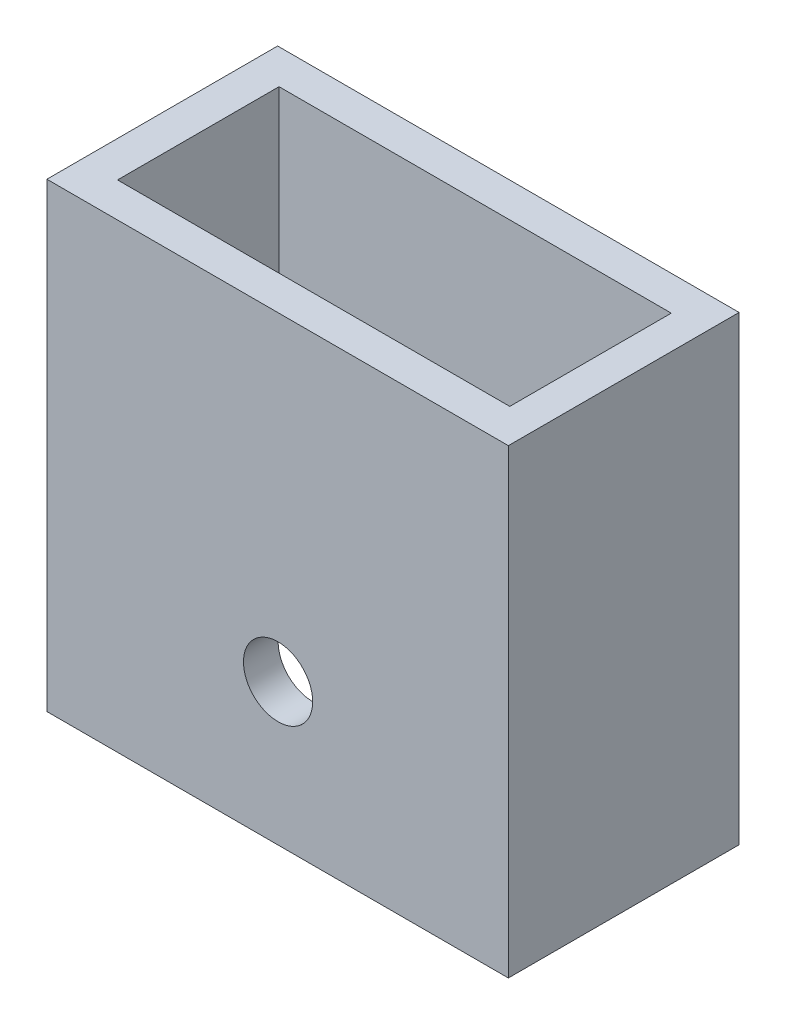
ISO-10303-21;
HEADER;
FILE_DESCRIPTION(('STEP AP214'),'2;1');
FILE_NAME('part.step','',(''),(''),'','','');
FILE_SCHEMA(('AUTOMOTIVE_DESIGN { 1 0 10303 214 1 1 1 1 }'));
ENDSEC;
DATA;
#1=APPLICATION_CONTEXT('core data for automotive mechanical design processes');
#2=APPLICATION_PROTOCOL_DEFINITION('international standard','automotive_design',2000,#1);
#3=PRODUCT_CONTEXT('',#1,'mechanical');
#4=PRODUCT('Part','Part','',(#3));
#5=PRODUCT_RELATED_PRODUCT_CATEGORY('part','',(#4));
#6=PRODUCT_DEFINITION_FORMATION('','',#4);
#7=PRODUCT_DEFINITION_CONTEXT('part definition',#1,'design');
#8=PRODUCT_DEFINITION('design','',#6,#7);
#9=PRODUCT_DEFINITION_SHAPE('','',#8);
#10=(LENGTH_UNIT() NAMED_UNIT(*) SI_UNIT(.MILLI.,.METRE.));
#11=(NAMED_UNIT(*) PLANE_ANGLE_UNIT() SI_UNIT($,.RADIAN.));
#12=(NAMED_UNIT(*) SI_UNIT($,.STERADIAN.) SOLID_ANGLE_UNIT());
#13=UNCERTAINTY_MEASURE_WITH_UNIT(LENGTH_MEASURE(1.E-05),#10,'distance_accuracy_value','');
#14=(GEOMETRIC_REPRESENTATION_CONTEXT(3) GLOBAL_UNCERTAINTY_ASSIGNED_CONTEXT((#13)) GLOBAL_UNIT_ASSIGNED_CONTEXT((#10,
#11,#12)) REPRESENTATION_CONTEXT('',''));
#15=CARTESIAN_POINT('',(0.,0.,0.));
#16=DIRECTION('',(0.,0.,1.));
#17=DIRECTION('',(1.,0.,0.));
#18=AXIS2_PLACEMENT_3D('',#15,#16,#17);
#19=CARTESIAN_POINT('',(-74.6877278250304,-25.5241833323692,20.));
#20=DIRECTION('',(1.,0.,0.));
#21=DIRECTION('',(0.,0.,-1.));
#22=AXIS2_PLACEMENT_3D('',#19,#20,#21);
#23=PLANE('',#22);
#24=DIRECTION('',(0.,-1.,0.));
#25=VECTOR('',#24,1.);
#26=CARTESIAN_POINT('',(-74.6877278250304,-25.5241833323692,0.));
#27=LINE('',#26,#25);
#28=CARTESIAN_POINT('',(-74.6877278250304,-25.5241833323692,0.));
#29=VERTEX_POINT('',#28);
#30=CARTESIAN_POINT('',(-74.6877278250304,-65.4861439549754,0.));
#31=VERTEX_POINT('',#30);
#32=EDGE_CURVE('E122',#29,#31,#27,.T.);
#33=ORIENTED_EDGE('',*,*,#32,.T.);
#34=DIRECTION('',(0.,0.,-1.));
#35=VECTOR('',#34,1.);
#36=CARTESIAN_POINT('',(-74.6877278250304,-65.4861439549754,20.));
#37=LINE('',#36,#35);
#38=CARTESIAN_POINT('',(-74.6877278250304,-65.4861439549754,20.));
#39=VERTEX_POINT('',#38);
#40=EDGE_CURVE('E155',#39,#31,#37,.T.);
#41=ORIENTED_EDGE('',*,*,#40,.F.);
#42=DIRECTION('',(0.,-1.,0.));
#43=VECTOR('',#42,1.);
#44=CARTESIAN_POINT('',(-74.6877278250304,-25.5241833323692,20.));
#45=LINE('',#44,#43);
#46=CARTESIAN_POINT('',(-74.6877278250304,-25.5241833323692,20.));
#47=VERTEX_POINT('',#46);
#48=EDGE_CURVE('E130',#47,#39,#45,.T.);
#49=ORIENTED_EDGE('',*,*,#48,.F.);
#50=DIRECTION('',(0.,0.,-1.));
#51=VECTOR('',#50,1.);
#52=CARTESIAN_POINT('',(-74.6877278250304,-25.5241833323692,20.));
#53=LINE('',#52,#51);
#54=EDGE_CURVE('E141',#47,#29,#53,.T.);
#55=ORIENTED_EDGE('',*,*,#54,.T.);
#56=EDGE_LOOP('',(#33,#41,#49,#55));
#57=FACE_BOUND('',#56,.T.);
#58=ADVANCED_FACE('F40',(#57),#23,.F.);
#59=CARTESIAN_POINT('',(-74.6877278250304,-65.4861439549754,20.));
#60=DIRECTION('',(0.,1.,0.));
#61=DIRECTION('',(0.,0.,1.));
#62=AXIS2_PLACEMENT_3D('',#59,#60,#61);
#63=PLANE('',#62);
#64=DIRECTION('',(1.,0.,0.));
#65=VECTOR('',#64,1.);
#66=CARTESIAN_POINT('',(-74.6877278250304,-65.4861439549754,2.99284329459113));
#67=LINE('',#66,#65);
#68=CARTESIAN_POINT('',(-71.5733372131021,-65.4861439549754,2.99284329459113));
#69=VERTEX_POINT('',#68);
#70=CARTESIAN_POINT('',(-37.5733372131021,-65.4861439549754,2.99284329459113));
#71=VERTEX_POINT('',#70);
#72=EDGE_CURVE('E121',#69,#71,#67,.T.);
#73=ORIENTED_EDGE('',*,*,#72,.F.);
#74=DIRECTION('',(0.,0.,1.));
#75=VECTOR('',#74,1.);
#76=CARTESIAN_POINT('',(-71.5733372131021,-65.4861439549754,20.));
#77=LINE('',#76,#75);
#78=CARTESIAN_POINT('',(-71.5733372131021,-65.4861439549754,16.9928432945911));
#79=VERTEX_POINT('',#78);
#80=EDGE_CURVE('E112',#69,#79,#77,.T.);
#81=ORIENTED_EDGE('',*,*,#80,.T.);
#82=DIRECTION('',(1.,0.,0.));
#83=VECTOR('',#82,1.);
#84=CARTESIAN_POINT('',(-74.6877278250304,-65.4861439549754,16.9928432945911));
#85=LINE('',#84,#83);
#86=CARTESIAN_POINT('',(-37.5733372131021,-65.4861439549754,16.9928432945911));
#87=VERTEX_POINT('',#86);
#88=EDGE_CURVE('E101',#79,#87,#85,.T.);
#89=ORIENTED_EDGE('',*,*,#88,.T.);
#90=DIRECTION('',(0.,0.,1.));
#91=VECTOR('',#90,1.);
#92=CARTESIAN_POINT('',(-37.5733372131021,-65.4861439549754,20.));
#93=LINE('',#92,#91);
#94=EDGE_CURVE('E106',#71,#87,#93,.T.);
#95=ORIENTED_EDGE('',*,*,#94,.F.);
#96=EDGE_LOOP('',(#73,#81,#89,#95));
#97=FACE_BOUND('',#96,.T.);
#98=DIRECTION('',(1.,0.,0.));
#99=VECTOR('',#98,1.);
#100=CARTESIAN_POINT('',(-74.6877278250304,-65.4861439549754,0.));
#101=LINE('',#100,#99);
#102=CARTESIAN_POINT('',(-34.6877278250304,-65.4861439549754,0.));
#103=VERTEX_POINT('',#102);
#104=EDGE_CURVE('E125',#31,#103,#101,.T.);
#105=ORIENTED_EDGE('',*,*,#104,.T.);
#106=DIRECTION('',(0.,0.,-1.));
#107=VECTOR('',#106,1.);
#108=CARTESIAN_POINT('',(-34.6877278250304,-65.4861439549754,20.));
#109=LINE('',#108,#107);
#110=CARTESIAN_POINT('',(-34.6877278250304,-65.4861439549754,20.));
#111=VERTEX_POINT('',#110);
#112=EDGE_CURVE('E153',#111,#103,#109,.T.);
#113=ORIENTED_EDGE('',*,*,#112,.F.);
#114=DIRECTION('',(1.,0.,0.));
#115=VECTOR('',#114,1.);
#116=CARTESIAN_POINT('',(-74.6877278250304,-65.4861439549754,20.));
#117=LINE('',#116,#115);
#118=EDGE_CURVE('E133',#39,#111,#117,.T.);
#119=ORIENTED_EDGE('',*,*,#118,.F.);
#120=ORIENTED_EDGE('',*,*,#40,.T.);
#121=EDGE_LOOP('',(#105,#113,#119,#120));
#122=FACE_BOUND('',#121,.T.);
#123=ADVANCED_FACE('F119',(#97,#122),#63,.F.);
#124=CARTESIAN_POINT('',(-34.6877278250304,-25.5241833323692,20.));
#125=DIRECTION('',(1.,0.,0.));
#126=DIRECTION('',(0.,0.,-1.));
#127=AXIS2_PLACEMENT_3D('',#124,#125,#126);
#128=PLANE('',#127);
#129=DIRECTION('',(0.,-1.,0.));
#130=VECTOR('',#129,1.);
#131=CARTESIAN_POINT('',(-34.6877278250304,-25.5241833323692,0.));
#132=LINE('',#131,#130);
#133=CARTESIAN_POINT('',(-34.6877278250304,-25.5241833323692,0.));
#134=VERTEX_POINT('',#133);
#135=EDGE_CURVE('E145',#134,#103,#132,.T.);
#136=ORIENTED_EDGE('',*,*,#135,.F.);
#137=DIRECTION('',(0.,0.,-1.));
#138=VECTOR('',#137,1.);
#139=CARTESIAN_POINT('',(-34.6877278250304,-25.5241833323692,20.));
#140=LINE('',#139,#138);
#141=CARTESIAN_POINT('',(-34.6877278250304,-25.5241833323692,20.));
#142=VERTEX_POINT('',#141);
#143=EDGE_CURVE('E151',#142,#134,#140,.T.);
#144=ORIENTED_EDGE('',*,*,#143,.F.);
#145=DIRECTION('',(0.,-1.,0.));
#146=VECTOR('',#145,1.);
#147=CARTESIAN_POINT('',(-34.6877278250304,-25.5241833323692,20.));
#148=LINE('',#147,#146);
#149=EDGE_CURVE('E136',#142,#111,#148,.T.);
#150=ORIENTED_EDGE('',*,*,#149,.T.);
#151=ORIENTED_EDGE('',*,*,#112,.T.);
#152=EDGE_LOOP('',(#136,#144,#150,#151));
#153=FACE_BOUND('',#152,.T.);
#154=ADVANCED_FACE('F195',(#153),#128,.T.);
#155=CARTESIAN_POINT('',(-74.6877278250304,-25.5241833323692,20.));
#156=DIRECTION('',(0.,1.,0.));
#157=DIRECTION('',(0.,0.,1.));
#158=AXIS2_PLACEMENT_3D('',#155,#156,#157);
#159=PLANE('',#158);
#160=DIRECTION('',(0.,0.,1.));
#161=VECTOR('',#160,1.);
#162=CARTESIAN_POINT('',(-71.5733372131021,-25.5241833323692,20.));
#163=LINE('',#162,#161);
#164=CARTESIAN_POINT('',(-71.5733372131021,-25.5241833323692,2.99284329459113));
#165=VERTEX_POINT('',#164);
#166=CARTESIAN_POINT('',(-71.5733372131021,-25.5241833323692,16.9928432945911));
#167=VERTEX_POINT('',#166);
#168=EDGE_CURVE('E11',#165,#167,#163,.T.);
#169=ORIENTED_EDGE('',*,*,#168,.F.);
#170=DIRECTION('',(1.,0.,0.));
#171=VECTOR('',#170,1.);
#172=CARTESIAN_POINT('',(-74.6877278250304,-25.5241833323692,2.99284329459113));
#173=LINE('',#172,#171);
#174=CARTESIAN_POINT('',(-37.5733372131021,-25.5241833323692,2.99284329459113));
#175=VERTEX_POINT('',#174);
#176=EDGE_CURVE('E48',#165,#175,#173,.T.);
#177=ORIENTED_EDGE('',*,*,#176,.T.);
#178=DIRECTION('',(0.,0.,1.));
#179=VECTOR('',#178,1.);
#180=CARTESIAN_POINT('',(-37.5733372131021,-25.5241833323692,20.));
#181=LINE('',#180,#179);
#182=CARTESIAN_POINT('',(-37.5733372131021,-25.5241833323692,16.9928432945911));
#183=VERTEX_POINT('',#182);
#184=EDGE_CURVE('E160',#175,#183,#181,.T.);
#185=ORIENTED_EDGE('',*,*,#184,.T.);
#186=DIRECTION('',(1.,0.,0.));
#187=VECTOR('',#186,1.);
#188=CARTESIAN_POINT('',(-74.6877278250304,-25.5241833323692,16.9928432945911));
#189=LINE('',#188,#187);
#190=EDGE_CURVE('E158',#167,#183,#189,.T.);
#191=ORIENTED_EDGE('',*,*,#190,.F.);
#192=EDGE_LOOP('',(#169,#177,#185,#191));
#193=FACE_BOUND('',#192,.T.);
#194=DIRECTION('',(1.,0.,0.));
#195=VECTOR('',#194,1.);
#196=CARTESIAN_POINT('',(-74.6877278250304,-25.5241833323692,0.));
#197=LINE('',#196,#195);
#198=EDGE_CURVE('E134',#29,#134,#197,.T.);
#199=ORIENTED_EDGE('',*,*,#198,.F.);
#200=ORIENTED_EDGE('',*,*,#54,.F.);
#201=DIRECTION('',(1.,0.,0.));
#202=VECTOR('',#201,1.);
#203=CARTESIAN_POINT('',(-74.6877278250304,-25.5241833323692,20.));
#204=LINE('',#203,#202);
#205=EDGE_CURVE('E139',#47,#142,#204,.T.);
#206=ORIENTED_EDGE('',*,*,#205,.T.);
#207=ORIENTED_EDGE('',*,*,#143,.T.);
#208=EDGE_LOOP('',(#199,#200,#206,#207));
#209=FACE_BOUND('',#208,.T.);
#210=ADVANCED_FACE('F165',(#193,#209),#159,.T.);
#211=CARTESIAN_POINT('',(0.,0.,20.));
#212=DIRECTION('',(0.,0.,1.));
#213=DIRECTION('',(1.,0.,0.));
#214=AXIS2_PLACEMENT_3D('',#211,#212,#213);
#215=PLANE('',#214);
#216=CARTESIAN_POINT('',(-54.6504099890505,-53.2304412932289,20.));
#217=DIRECTION('',(0.,0.,1.));
#218=DIRECTION('',(1.,0.,0.));
#219=AXIS2_PLACEMENT_3D('',#216,#217,#218);
#220=CIRCLE('',#219,2.99999999999999);
#221=CARTESIAN_POINT('',(-51.6504099890505,-53.2304412932289,20.));
#222=VERTEX_POINT('',#221);
#223=EDGE_CURVE('E327',#222,#222,#220,.T.);
#224=ORIENTED_EDGE('',*,*,#223,.F.);
#225=EDGE_LOOP('',(#224));
#226=FACE_BOUND('',#225,.T.);
#227=ORIENTED_EDGE('',*,*,#48,.T.);
#228=ORIENTED_EDGE('',*,*,#118,.T.);
#229=ORIENTED_EDGE('',*,*,#149,.F.);
#230=ORIENTED_EDGE('',*,*,#205,.F.);
#231=EDGE_LOOP('',(#227,#228,#229,#230));
#232=FACE_BOUND('',#231,.T.);
#233=ADVANCED_FACE('F208',(#226,#232),#215,.T.);
#234=CARTESIAN_POINT('',(0.,0.,0.));
#235=DIRECTION('',(0.,0.,1.));
#236=DIRECTION('',(1.,0.,0.));
#237=AXIS2_PLACEMENT_3D('',#234,#235,#236);
#238=PLANE('',#237);
#239=CARTESIAN_POINT('',(-54.6504099890505,-53.2304412932289,0.));
#240=DIRECTION('',(0.,0.,1.));
#241=DIRECTION('',(1.,0.,0.));
#242=AXIS2_PLACEMENT_3D('',#239,#240,#241);
#243=CIRCLE('',#242,2.99999999999999);
#244=CARTESIAN_POINT('',(-51.6504099890505,-53.2304412932289,0.));
#245=VERTEX_POINT('',#244);
#246=EDGE_CURVE('E116',#245,#245,#243,.T.);
#247=ORIENTED_EDGE('',*,*,#246,.T.);
#248=EDGE_LOOP('',(#247));
#249=FACE_BOUND('',#248,.T.);
#250=ORIENTED_EDGE('',*,*,#32,.F.);
#251=ORIENTED_EDGE('',*,*,#198,.T.);
#252=ORIENTED_EDGE('',*,*,#135,.T.);
#253=ORIENTED_EDGE('',*,*,#104,.F.);
#254=EDGE_LOOP('',(#250,#251,#252,#253));
#255=FACE_BOUND('',#254,.T.);
#256=ADVANCED_FACE('F201',(#249,#255),#238,.F.);
#257=CARTESIAN_POINT('',(-71.5733372131021,-200.,2.99284329459113));
#258=DIRECTION('',(-1.,0.,0.));
#259=DIRECTION('',(0.,0.,1.));
#260=AXIS2_PLACEMENT_3D('',#257,#258,#259);
#261=PLANE('',#260);
#262=DIRECTION('',(0.,1.,0.));
#263=VECTOR('',#262,1.);
#264=CARTESIAN_POINT('',(-71.5733372131021,-200.,2.99284329459113));
#265=LINE('',#264,#263);
#266=EDGE_CURVE('E107',#69,#165,#265,.T.);
#267=ORIENTED_EDGE('',*,*,#266,.T.);
#268=ORIENTED_EDGE('',*,*,#168,.T.);
#269=DIRECTION('',(0.,1.,0.));
#270=VECTOR('',#269,1.);
#271=CARTESIAN_POINT('',(-71.5733372131021,-200.,16.9928432945911));
#272=LINE('',#271,#270);
#273=EDGE_CURVE('E60',#79,#167,#272,.T.);
#274=ORIENTED_EDGE('',*,*,#273,.F.);
#275=ORIENTED_EDGE('',*,*,#80,.F.);
#276=EDGE_LOOP('',(#267,#268,#274,#275));
#277=FACE_BOUND('',#276,.T.);
#278=ADVANCED_FACE('F111',(#277),#261,.F.);
#279=CARTESIAN_POINT('',(-71.5733372131021,-200.,2.99284329459113));
#280=DIRECTION('',(0.,0.,1.));
#281=DIRECTION('',(1.,0.,0.));
#282=AXIS2_PLACEMENT_3D('',#279,#280,#281);
#283=PLANE('',#282);
#284=CARTESIAN_POINT('',(-54.6504099890505,-53.2304412932289,2.99284329459112));
#285=DIRECTION('',(0.,0.,1.));
#286=DIRECTION('',(1.,0.,0.));
#287=AXIS2_PLACEMENT_3D('',#284,#285,#286);
#288=CIRCLE('',#287,2.99999999999999);
#289=CARTESIAN_POINT('',(-51.6504099890505,-53.2304412932289,2.99284329459112));
#290=VERTEX_POINT('',#289);
#291=EDGE_CURVE('E323',#290,#290,#288,.T.);
#292=ORIENTED_EDGE('',*,*,#291,.F.);
#293=EDGE_LOOP('',(#292));
#294=FACE_BOUND('',#293,.T.);
#295=ORIENTED_EDGE('',*,*,#72,.T.);
#296=DIRECTION('',(0.,1.,0.));
#297=VECTOR('',#296,1.);
#298=CARTESIAN_POINT('',(-37.5733372131021,-200.,2.99284329459113));
#299=LINE('',#298,#297);
#300=EDGE_CURVE('E171',#71,#175,#299,.T.);
#301=ORIENTED_EDGE('',*,*,#300,.T.);
#302=ORIENTED_EDGE('',*,*,#176,.F.);
#303=ORIENTED_EDGE('',*,*,#266,.F.);
#304=EDGE_LOOP('',(#295,#301,#302,#303));
#305=FACE_BOUND('',#304,.T.);
#306=ADVANCED_FACE('F169',(#294,#305),#283,.T.);
#307=CARTESIAN_POINT('',(-37.5733372131021,-200.,2.99284329459113));
#308=DIRECTION('',(-1.,0.,0.));
#309=DIRECTION('',(0.,0.,1.));
#310=AXIS2_PLACEMENT_3D('',#307,#308,#309);
#311=PLANE('',#310);
#312=ORIENTED_EDGE('',*,*,#94,.T.);
#313=DIRECTION('',(0.,1.,0.));
#314=VECTOR('',#313,1.);
#315=CARTESIAN_POINT('',(-37.5733372131021,-200.,16.9928432945911));
#316=LINE('',#315,#314);
#317=EDGE_CURVE('E55',#87,#183,#316,.T.);
#318=ORIENTED_EDGE('',*,*,#317,.T.);
#319=ORIENTED_EDGE('',*,*,#184,.F.);
#320=ORIENTED_EDGE('',*,*,#300,.F.);
#321=EDGE_LOOP('',(#312,#318,#319,#320));
#322=FACE_BOUND('',#321,.T.);
#323=ADVANCED_FACE('F178',(#322),#311,.T.);
#324=CARTESIAN_POINT('',(-71.5733372131021,-200.,16.9928432945911));
#325=DIRECTION('',(0.,0.,1.));
#326=DIRECTION('',(1.,0.,0.));
#327=AXIS2_PLACEMENT_3D('',#324,#325,#326);
#328=PLANE('',#327);
#329=CARTESIAN_POINT('',(-54.6504099890505,-53.2304412932289,16.9928432945911));
#330=DIRECTION('',(0.,0.,1.));
#331=DIRECTION('',(1.,0.,0.));
#332=AXIS2_PLACEMENT_3D('',#329,#330,#331);
#333=CIRCLE('',#332,2.99999999999999);
#334=CARTESIAN_POINT('',(-51.6504099890505,-53.2304412932289,16.9928432945911));
#335=VERTEX_POINT('',#334);
#336=EDGE_CURVE('E43',#335,#335,#333,.T.);
#337=ORIENTED_EDGE('',*,*,#336,.T.);
#338=EDGE_LOOP('',(#337));
#339=FACE_BOUND('',#338,.T.);
#340=ORIENTED_EDGE('',*,*,#273,.T.);
#341=ORIENTED_EDGE('',*,*,#190,.T.);
#342=ORIENTED_EDGE('',*,*,#317,.F.);
#343=ORIENTED_EDGE('',*,*,#88,.F.);
#344=EDGE_LOOP('',(#340,#341,#342,#343));
#345=FACE_BOUND('',#344,.T.);
#346=ADVANCED_FACE('F102',(#339,#345),#328,.F.);
#347=CARTESIAN_POINT('',(-54.6504099890505,-53.2304412932289,-180.));
#348=DIRECTION('',(0.,0.,1.));
#349=DIRECTION('',(1.,0.,0.));
#350=AXIS2_PLACEMENT_3D('',#347,#348,#349);
#351=CYLINDRICAL_SURFACE('',#350,2.99999999999999);
#352=ORIENTED_EDGE('',*,*,#223,.T.);
#353=EDGE_LOOP('',(#352));
#354=FACE_BOUND('',#353,.T.);
#355=ORIENTED_EDGE('',*,*,#336,.F.);
#356=EDGE_LOOP('',(#355));
#357=FACE_BOUND('',#356,.T.);
#358=ADVANCED_FACE('F185',(#354,#357),#351,.F.);
#359=ORIENTED_EDGE('',*,*,#291,.T.);
#360=EDGE_LOOP('',(#359));
#361=FACE_BOUND('',#360,.T.);
#362=ORIENTED_EDGE('',*,*,#246,.F.);
#363=EDGE_LOOP('',(#362));
#364=FACE_BOUND('',#363,.T.);
#365=ADVANCED_FACE('F282',(#361,#364),#351,.F.);
#366=CLOSED_SHELL('',(#58,#123,#154,#210,#233,#256,#278,#306,#323,#346,#358,#365));
#367=MANIFOLD_SOLID_BREP('B2',#366);
#368=ADVANCED_BREP_SHAPE_REPRESENTATION('',(#18,#367),#14);
#369=SHAPE_DEFINITION_REPRESENTATION(#9,#368);
ENDSEC;
END-ISO-10303-21;
